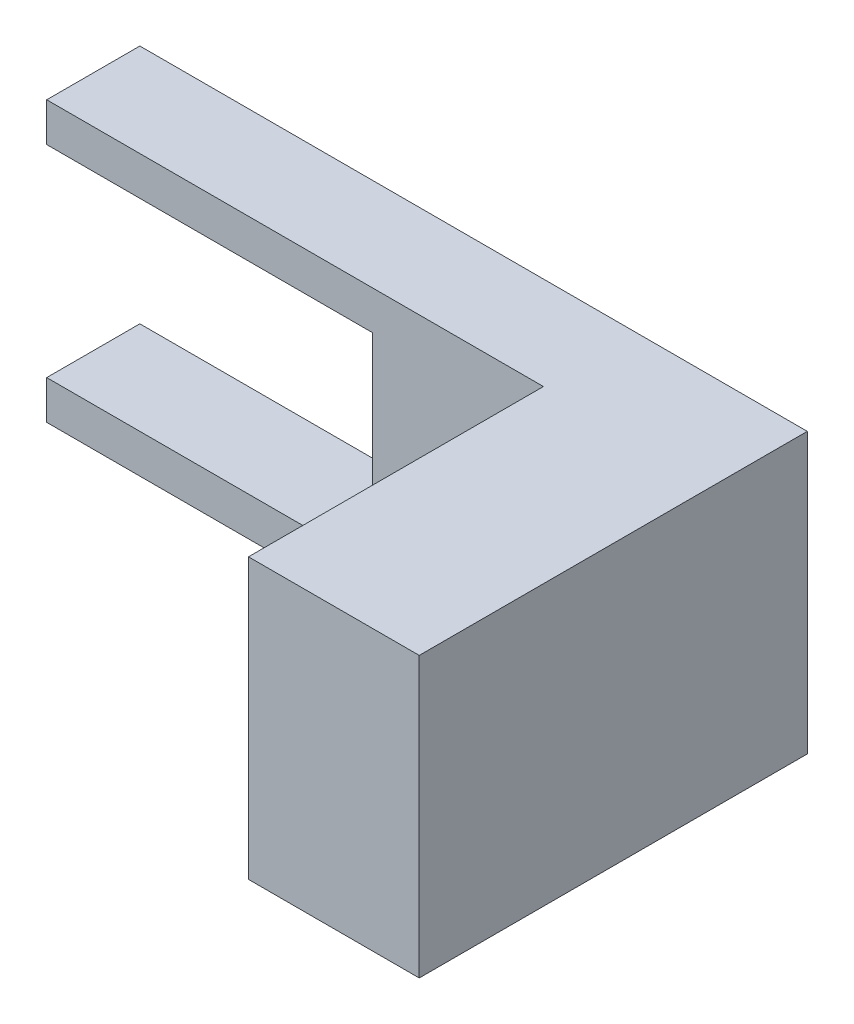
ISO-10303-21;
HEADER;
FILE_DESCRIPTION(('STEP AP214'),'2;1');
FILE_NAME('part.step','',(''),(''),'','','');
FILE_SCHEMA(('AUTOMOTIVE_DESIGN { 1 0 10303 214 1 1 1 1 }'));
ENDSEC;
DATA;
#1=APPLICATION_CONTEXT('core data for automotive mechanical design processes');
#2=APPLICATION_PROTOCOL_DEFINITION('international standard','automotive_design',2000,#1);
#3=PRODUCT_CONTEXT('',#1,'mechanical');
#4=PRODUCT('Part','Part','',(#3));
#5=PRODUCT_RELATED_PRODUCT_CATEGORY('part','',(#4));
#6=PRODUCT_DEFINITION_FORMATION('','',#4);
#7=PRODUCT_DEFINITION_CONTEXT('part definition',#1,'design');
#8=PRODUCT_DEFINITION('design','',#6,#7);
#9=PRODUCT_DEFINITION_SHAPE('','',#8);
#10=(LENGTH_UNIT() NAMED_UNIT(*) SI_UNIT(.MILLI.,.METRE.));
#11=(NAMED_UNIT(*) PLANE_ANGLE_UNIT() SI_UNIT($,.RADIAN.));
#12=(NAMED_UNIT(*) SI_UNIT($,.STERADIAN.) SOLID_ANGLE_UNIT());
#13=UNCERTAINTY_MEASURE_WITH_UNIT(LENGTH_MEASURE(1.E-05),#10,'distance_accuracy_value','');
#14=(GEOMETRIC_REPRESENTATION_CONTEXT(3) GLOBAL_UNCERTAINTY_ASSIGNED_CONTEXT((#13)) GLOBAL_UNIT_ASSIGNED_CONTEXT((#10,
#11,#12)) REPRESENTATION_CONTEXT('',''));
#15=CARTESIAN_POINT('',(0.,0.,0.));
#16=DIRECTION('',(0.,0.,1.));
#17=DIRECTION('',(1.,0.,0.));
#18=AXIS2_PLACEMENT_3D('',#15,#16,#17);
#19=CARTESIAN_POINT('',(-10.3666666666667,18.,-18.3833333333333));
#20=DIRECTION('',(1.,0.,0.));
#21=DIRECTION('',(0.,0.,-1.));
#22=AXIS2_PLACEMENT_3D('',#19,#20,#21);
#23=PLANE('',#22);
#24=DIRECTION('',(0.,-1.,0.));
#25=VECTOR('',#24,1.);
#26=CARTESIAN_POINT('',(-10.3666666666667,18.,-18.3833333333333));
#27=LINE('',#26,#25);
#28=CARTESIAN_POINT('',(-10.3666666666667,2.5,-18.3833333333333));
#29=VERTEX_POINT('',#28);
#30=CARTESIAN_POINT('',(-10.3666666666667,0.,-18.3833333333333));
#31=VERTEX_POINT('',#30);
#32=EDGE_CURVE('E150',#29,#31,#27,.T.);
#33=ORIENTED_EDGE('',*,*,#32,.F.);
#34=DIRECTION('',(0.,0.,-1.));
#35=VECTOR('',#34,1.);
#36=CARTESIAN_POINT('',(-10.3666666666667,2.5,-18.3833333333333));
#37=LINE('',#36,#35);
#38=CARTESIAN_POINT('',(-10.3666666666667,2.5,-24.3833333333333));
#39=VERTEX_POINT('',#38);
#40=EDGE_CURVE('E133',#29,#39,#37,.T.);
#41=ORIENTED_EDGE('',*,*,#40,.T.);
#42=DIRECTION('',(0.,-1.,0.));
#43=VECTOR('',#42,1.);
#44=CARTESIAN_POINT('',(-10.3666666666667,18.,-24.3833333333333));
#45=LINE('',#44,#43);
#46=CARTESIAN_POINT('',(-10.3666666666667,0.,-24.3833333333333));
#47=VERTEX_POINT('',#46);
#48=EDGE_CURVE('E84',#39,#47,#45,.T.);
#49=ORIENTED_EDGE('',*,*,#48,.T.);
#50=DIRECTION('',(0.,0.,1.));
#51=VECTOR('',#50,1.);
#52=CARTESIAN_POINT('',(-10.3666666666667,0.,-18.3833333333333));
#53=LINE('',#52,#51);
#54=EDGE_CURVE('E130',#47,#31,#53,.T.);
#55=ORIENTED_EDGE('',*,*,#54,.T.);
#56=EDGE_LOOP('',(#33,#41,#49,#55));
#57=FACE_BOUND('',#56,.T.);
#58=ADVANCED_FACE('F32',(#57),#23,.F.);
#59=CARTESIAN_POINT('',(-10.3666666666667,18.,-24.3833333333333));
#60=VERTEX_POINT('',#59);
#61=CARTESIAN_POINT('',(-10.3666666666667,15.5,-24.3833333333333));
#62=VERTEX_POINT('',#61);
#63=EDGE_CURVE('E143',#60,#62,#45,.T.);
#64=ORIENTED_EDGE('',*,*,#63,.T.);
#65=DIRECTION('',(0.,0.,1.));
#66=VECTOR('',#65,1.);
#67=CARTESIAN_POINT('',(-10.3666666666667,15.5,-18.3833333333333));
#68=LINE('',#67,#66);
#69=CARTESIAN_POINT('',(-10.3666666666667,15.5,-18.3833333333333));
#70=VERTEX_POINT('',#69);
#71=EDGE_CURVE('E47',#62,#70,#68,.T.);
#72=ORIENTED_EDGE('',*,*,#71,.T.);
#73=CARTESIAN_POINT('',(-10.3666666666667,18.,-18.3833333333333));
#74=VERTEX_POINT('',#73);
#75=EDGE_CURVE('E40',#74,#70,#27,.T.);
#76=ORIENTED_EDGE('',*,*,#75,.F.);
#77=DIRECTION('',(0.,0.,1.));
#78=VECTOR('',#77,1.);
#79=CARTESIAN_POINT('',(-10.3666666666667,18.,-18.3833333333333));
#80=LINE('',#79,#78);
#81=EDGE_CURVE('E142',#60,#74,#80,.T.);
#82=ORIENTED_EDGE('',*,*,#81,.F.);
#83=EDGE_LOOP('',(#64,#72,#76,#82));
#84=FACE_BOUND('',#83,.T.);
#85=ADVANCED_FACE('F34',(#84),#23,.F.);
#86=CARTESIAN_POINT('',(21.6333333333333,18.,-18.3833333333333));
#87=DIRECTION('',(0.,0.,-1.));
#88=DIRECTION('',(-1.,0.,0.));
#89=AXIS2_PLACEMENT_3D('',#86,#87,#88);
#90=PLANE('',#89);
#91=DIRECTION('',(0.,1.,0.));
#92=VECTOR('',#91,1.);
#93=CARTESIAN_POINT('',(10.6333333333333,2.5,-18.3833333333333));
#94=LINE('',#93,#92);
#95=CARTESIAN_POINT('',(10.6333333333333,2.5,-18.3833333333333));
#96=VERTEX_POINT('',#95);
#97=CARTESIAN_POINT('',(10.6333333333333,15.5,-18.3833333333333));
#98=VERTEX_POINT('',#97);
#99=EDGE_CURVE('E191',#96,#98,#94,.T.);
#100=ORIENTED_EDGE('',*,*,#99,.F.);
#101=DIRECTION('',(1.,0.,0.));
#102=VECTOR('',#101,1.);
#103=CARTESIAN_POINT('',(-31.3666666666667,2.5,-18.3833333333333));
#104=LINE('',#103,#102);
#105=EDGE_CURVE('E161',#29,#96,#104,.T.);
#106=ORIENTED_EDGE('',*,*,#105,.F.);
#107=ORIENTED_EDGE('',*,*,#32,.T.);
#108=DIRECTION('',(1.,0.,0.));
#109=VECTOR('',#108,1.);
#110=CARTESIAN_POINT('',(21.6333333333333,0.,-18.3833333333333));
#111=LINE('',#110,#109);
#112=CARTESIAN_POINT('',(21.6333333333333,0.,-18.3833333333333));
#113=VERTEX_POINT('',#112);
#114=EDGE_CURVE('E132',#31,#113,#111,.T.);
#115=ORIENTED_EDGE('',*,*,#114,.T.);
#116=DIRECTION('',(0.,-1.,0.));
#117=VECTOR('',#116,1.);
#118=CARTESIAN_POINT('',(21.6333333333333,18.,-18.3833333333333));
#119=LINE('',#118,#117);
#120=CARTESIAN_POINT('',(21.6333333333333,18.,-18.3833333333333));
#121=VERTEX_POINT('',#120);
#122=EDGE_CURVE('E148',#121,#113,#119,.T.);
#123=ORIENTED_EDGE('',*,*,#122,.F.);
#124=DIRECTION('',(1.,0.,0.));
#125=VECTOR('',#124,1.);
#126=CARTESIAN_POINT('',(21.6333333333333,18.,-18.3833333333333));
#127=LINE('',#126,#125);
#128=EDGE_CURVE('E93',#74,#121,#127,.T.);
#129=ORIENTED_EDGE('',*,*,#128,.F.);
#130=ORIENTED_EDGE('',*,*,#75,.T.);
#131=DIRECTION('',(-1.,0.,0.));
#132=VECTOR('',#131,1.);
#133=CARTESIAN_POINT('',(-31.3666666666667,15.5,-18.3833333333333));
#134=LINE('',#133,#132);
#135=EDGE_CURVE('E194',#98,#70,#134,.T.);
#136=ORIENTED_EDGE('',*,*,#135,.F.);
#137=EDGE_LOOP('',(#100,#106,#107,#115,#123,#129,#130,#136));
#138=FACE_BOUND('',#137,.T.);
#139=ADVANCED_FACE('F158',(#138),#90,.F.);
#140=CARTESIAN_POINT('',(21.6333333333333,18.,0.616666666666675));
#141=DIRECTION('',(1.,0.,0.));
#142=DIRECTION('',(0.,0.,-1.));
#143=AXIS2_PLACEMENT_3D('',#140,#141,#142);
#144=PLANE('',#143);
#145=DIRECTION('',(0.,0.,1.));
#146=VECTOR('',#145,1.);
#147=CARTESIAN_POINT('',(21.6333333333333,0.,0.616666666666675));
#148=LINE('',#147,#146);
#149=CARTESIAN_POINT('',(21.6333333333333,0.,0.616666666666675));
#150=VERTEX_POINT('',#149);
#151=EDGE_CURVE('E135',#113,#150,#148,.T.);
#152=ORIENTED_EDGE('',*,*,#151,.T.);
#153=DIRECTION('',(0.,-1.,0.));
#154=VECTOR('',#153,1.);
#155=CARTESIAN_POINT('',(21.6333333333333,18.,0.616666666666675));
#156=LINE('',#155,#154);
#157=CARTESIAN_POINT('',(21.6333333333333,18.,0.616666666666675));
#158=VERTEX_POINT('',#157);
#159=EDGE_CURVE('E121',#158,#150,#156,.T.);
#160=ORIENTED_EDGE('',*,*,#159,.F.);
#161=DIRECTION('',(0.,0.,1.));
#162=VECTOR('',#161,1.);
#163=CARTESIAN_POINT('',(21.6333333333333,18.,0.616666666666675));
#164=LINE('',#163,#162);
#165=EDGE_CURVE('E109',#121,#158,#164,.T.);
#166=ORIENTED_EDGE('',*,*,#165,.F.);
#167=ORIENTED_EDGE('',*,*,#122,.T.);
#168=EDGE_LOOP('',(#152,#160,#166,#167));
#169=FACE_BOUND('',#168,.T.);
#170=ADVANCED_FACE('F175',(#169),#144,.F.);
#171=CARTESIAN_POINT('',(32.6333333333333,18.,0.616666666666675));
#172=DIRECTION('',(0.,0.,-1.));
#173=DIRECTION('',(-1.,0.,0.));
#174=AXIS2_PLACEMENT_3D('',#171,#172,#173);
#175=PLANE('',#174);
#176=DIRECTION('',(1.,0.,0.));
#177=VECTOR('',#176,1.);
#178=CARTESIAN_POINT('',(32.6333333333333,0.,0.616666666666675));
#179=LINE('',#178,#177);
#180=CARTESIAN_POINT('',(32.6333333333333,0.,0.616666666666675));
#181=VERTEX_POINT('',#180);
#182=EDGE_CURVE('E118',#150,#181,#179,.T.);
#183=ORIENTED_EDGE('',*,*,#182,.T.);
#184=DIRECTION('',(0.,-1.,0.));
#185=VECTOR('',#184,1.);
#186=CARTESIAN_POINT('',(32.6333333333333,18.,0.616666666666675));
#187=LINE('',#186,#185);
#188=CARTESIAN_POINT('',(32.6333333333333,18.,0.616666666666675));
#189=VERTEX_POINT('',#188);
#190=EDGE_CURVE('E115',#189,#181,#187,.T.);
#191=ORIENTED_EDGE('',*,*,#190,.F.);
#192=DIRECTION('',(1.,0.,0.));
#193=VECTOR('',#192,1.);
#194=CARTESIAN_POINT('',(32.6333333333333,18.,0.616666666666675));
#195=LINE('',#194,#193);
#196=EDGE_CURVE('E102',#158,#189,#195,.T.);
#197=ORIENTED_EDGE('',*,*,#196,.F.);
#198=ORIENTED_EDGE('',*,*,#159,.T.);
#199=EDGE_LOOP('',(#183,#191,#197,#198));
#200=FACE_BOUND('',#199,.T.);
#201=ADVANCED_FACE('F116',(#200),#175,.F.);
#202=CARTESIAN_POINT('',(32.6333333333333,18.,-24.3833333333333));
#203=DIRECTION('',(-1.,0.,0.));
#204=DIRECTION('',(0.,0.,1.));
#205=AXIS2_PLACEMENT_3D('',#202,#203,#204);
#206=PLANE('',#205);
#207=DIRECTION('',(0.,0.,-1.));
#208=VECTOR('',#207,1.);
#209=CARTESIAN_POINT('',(32.6333333333333,0.,-24.3833333333333));
#210=LINE('',#209,#208);
#211=CARTESIAN_POINT('',(32.6333333333333,0.,-24.3833333333333));
#212=VERTEX_POINT('',#211);
#213=EDGE_CURVE('E138',#181,#212,#210,.T.);
#214=ORIENTED_EDGE('',*,*,#213,.T.);
#215=DIRECTION('',(0.,-1.,0.));
#216=VECTOR('',#215,1.);
#217=CARTESIAN_POINT('',(32.6333333333333,18.,-24.3833333333333));
#218=LINE('',#217,#216);
#219=CARTESIAN_POINT('',(32.6333333333333,18.,-24.3833333333333));
#220=VERTEX_POINT('',#219);
#221=EDGE_CURVE('E122',#220,#212,#218,.T.);
#222=ORIENTED_EDGE('',*,*,#221,.F.);
#223=DIRECTION('',(0.,0.,-1.));
#224=VECTOR('',#223,1.);
#225=CARTESIAN_POINT('',(32.6333333333333,18.,-24.3833333333333));
#226=LINE('',#225,#224);
#227=EDGE_CURVE('E106',#189,#220,#226,.T.);
#228=ORIENTED_EDGE('',*,*,#227,.F.);
#229=ORIENTED_EDGE('',*,*,#190,.T.);
#230=EDGE_LOOP('',(#214,#222,#228,#229));
#231=FACE_BOUND('',#230,.T.);
#232=ADVANCED_FACE('F124',(#231),#206,.F.);
#233=CARTESIAN_POINT('',(-10.3666666666667,18.,-24.3833333333333));
#234=DIRECTION('',(0.,0.,1.));
#235=DIRECTION('',(1.,0.,0.));
#236=AXIS2_PLACEMENT_3D('',#233,#234,#235);
#237=PLANE('',#236);
#238=ORIENTED_EDGE('',*,*,#48,.F.);
#239=DIRECTION('',(1.,0.,0.));
#240=VECTOR('',#239,1.);
#241=CARTESIAN_POINT('',(-10.3666666666667,2.5,-24.3833333333333));
#242=LINE('',#241,#240);
#243=CARTESIAN_POINT('',(10.6333333333333,2.5,-24.3833333333333));
#244=VERTEX_POINT('',#243);
#245=EDGE_CURVE('E11',#39,#244,#242,.T.);
#246=ORIENTED_EDGE('',*,*,#245,.T.);
#247=DIRECTION('',(0.,1.,0.));
#248=VECTOR('',#247,1.);
#249=CARTESIAN_POINT('',(10.6333333333333,2.5,-24.3833333333333));
#250=LINE('',#249,#248);
#251=CARTESIAN_POINT('',(10.6333333333333,15.5,-24.3833333333333));
#252=VERTEX_POINT('',#251);
#253=EDGE_CURVE('E183',#244,#252,#250,.T.);
#254=ORIENTED_EDGE('',*,*,#253,.T.);
#255=DIRECTION('',(-1.,0.,0.));
#256=VECTOR('',#255,1.);
#257=CARTESIAN_POINT('',(-31.3666666666667,15.5,-24.3833333333333));
#258=LINE('',#257,#256);
#259=EDGE_CURVE('E180',#252,#62,#258,.T.);
#260=ORIENTED_EDGE('',*,*,#259,.T.);
#261=ORIENTED_EDGE('',*,*,#63,.F.);
#262=DIRECTION('',(-1.,0.,0.));
#263=VECTOR('',#262,1.);
#264=CARTESIAN_POINT('',(-10.3666666666667,18.,-24.3833333333333));
#265=LINE('',#264,#263);
#266=EDGE_CURVE('E56',#220,#60,#265,.T.);
#267=ORIENTED_EDGE('',*,*,#266,.F.);
#268=ORIENTED_EDGE('',*,*,#221,.T.);
#269=DIRECTION('',(-1.,0.,0.));
#270=VECTOR('',#269,1.);
#271=CARTESIAN_POINT('',(-10.3666666666667,0.,-24.3833333333333));
#272=LINE('',#271,#270);
#273=EDGE_CURVE('E140',#212,#47,#272,.T.);
#274=ORIENTED_EDGE('',*,*,#273,.T.);
#275=EDGE_LOOP('',(#238,#246,#254,#260,#261,#267,#268,#274));
#276=FACE_BOUND('',#275,.T.);
#277=ADVANCED_FACE('F178',(#276),#237,.F.);
#278=CARTESIAN_POINT('',(0.,18.,0.));
#279=DIRECTION('',(0.,-1.,0.));
#280=DIRECTION('',(0.,0.,-1.));
#281=AXIS2_PLACEMENT_3D('',#278,#279,#280);
#282=PLANE('',#281);
#283=ORIENTED_EDGE('',*,*,#81,.T.);
#284=ORIENTED_EDGE('',*,*,#128,.T.);
#285=ORIENTED_EDGE('',*,*,#165,.T.);
#286=ORIENTED_EDGE('',*,*,#196,.T.);
#287=ORIENTED_EDGE('',*,*,#227,.T.);
#288=ORIENTED_EDGE('',*,*,#266,.T.);
#289=EDGE_LOOP('',(#283,#284,#285,#286,#287,#288));
#290=FACE_BOUND('',#289,.T.);
#291=ADVANCED_FACE('F104',(#290),#282,.F.);
#292=CARTESIAN_POINT('',(0.,0.,0.));
#293=DIRECTION('',(0.,-1.,0.));
#294=DIRECTION('',(0.,0.,-1.));
#295=AXIS2_PLACEMENT_3D('',#292,#293,#294);
#296=PLANE('',#295);
#297=ORIENTED_EDGE('',*,*,#54,.F.);
#298=ORIENTED_EDGE('',*,*,#273,.F.);
#299=ORIENTED_EDGE('',*,*,#213,.F.);
#300=ORIENTED_EDGE('',*,*,#182,.F.);
#301=ORIENTED_EDGE('',*,*,#151,.F.);
#302=ORIENTED_EDGE('',*,*,#114,.F.);
#303=EDGE_LOOP('',(#297,#298,#299,#300,#301,#302));
#304=FACE_BOUND('',#303,.T.);
#305=ADVANCED_FACE('F165',(#304),#296,.T.);
#306=CARTESIAN_POINT('',(-31.3666666666667,2.5,-24.3833333333333));
#307=DIRECTION('',(0.,-1.,0.));
#308=DIRECTION('',(0.,0.,-1.));
#309=AXIS2_PLACEMENT_3D('',#306,#307,#308);
#310=PLANE('',#309);
#311=ORIENTED_EDGE('',*,*,#105,.T.);
#312=DIRECTION('',(0.,0.,1.));
#313=VECTOR('',#312,1.);
#314=CARTESIAN_POINT('',(10.6333333333333,2.5,-24.3833333333333));
#315=LINE('',#314,#313);
#316=EDGE_CURVE('E187',#244,#96,#315,.T.);
#317=ORIENTED_EDGE('',*,*,#316,.F.);
#318=ORIENTED_EDGE('',*,*,#245,.F.);
#319=ORIENTED_EDGE('',*,*,#40,.F.);
#320=EDGE_LOOP('',(#311,#317,#318,#319));
#321=FACE_BOUND('',#320,.T.);
#322=ADVANCED_FACE('F220',(#321),#310,.F.);
#323=CARTESIAN_POINT('',(-31.3666666666667,15.5,-24.3833333333333));
#324=DIRECTION('',(0.,1.,0.));
#325=DIRECTION('',(0.,0.,1.));
#326=AXIS2_PLACEMENT_3D('',#323,#324,#325);
#327=PLANE('',#326);
#328=ORIENTED_EDGE('',*,*,#259,.F.);
#329=DIRECTION('',(0.,0.,1.));
#330=VECTOR('',#329,1.);
#331=CARTESIAN_POINT('',(10.6333333333333,15.5,-24.3833333333333));
#332=LINE('',#331,#330);
#333=EDGE_CURVE('E185',#252,#98,#332,.T.);
#334=ORIENTED_EDGE('',*,*,#333,.T.);
#335=ORIENTED_EDGE('',*,*,#135,.T.);
#336=ORIENTED_EDGE('',*,*,#71,.F.);
#337=EDGE_LOOP('',(#328,#334,#335,#336));
#338=FACE_BOUND('',#337,.T.);
#339=ADVANCED_FACE('F218',(#338),#327,.F.);
#340=CARTESIAN_POINT('',(10.6333333333333,2.5,-24.3833333333333));
#341=DIRECTION('',(1.,0.,0.));
#342=DIRECTION('',(0.,0.,-1.));
#343=AXIS2_PLACEMENT_3D('',#340,#341,#342);
#344=PLANE('',#343);
#345=ORIENTED_EDGE('',*,*,#99,.T.);
#346=ORIENTED_EDGE('',*,*,#333,.F.);
#347=ORIENTED_EDGE('',*,*,#253,.F.);
#348=ORIENTED_EDGE('',*,*,#316,.T.);
#349=EDGE_LOOP('',(#345,#346,#347,#348));
#350=FACE_BOUND('',#349,.T.);
#351=ADVANCED_FACE('F217',(#350),#344,.F.);
#352=CLOSED_SHELL('',(#58,#85,#139,#170,#201,#232,#277,#291,#305,#322,#339,#351));
#353=MANIFOLD_SOLID_BREP('B2',#352);
#354=ADVANCED_BREP_SHAPE_REPRESENTATION('',(#18,#353),#14);
#355=SHAPE_DEFINITION_REPRESENTATION(#9,#354);
ENDSEC;
END-ISO-10303-21;
